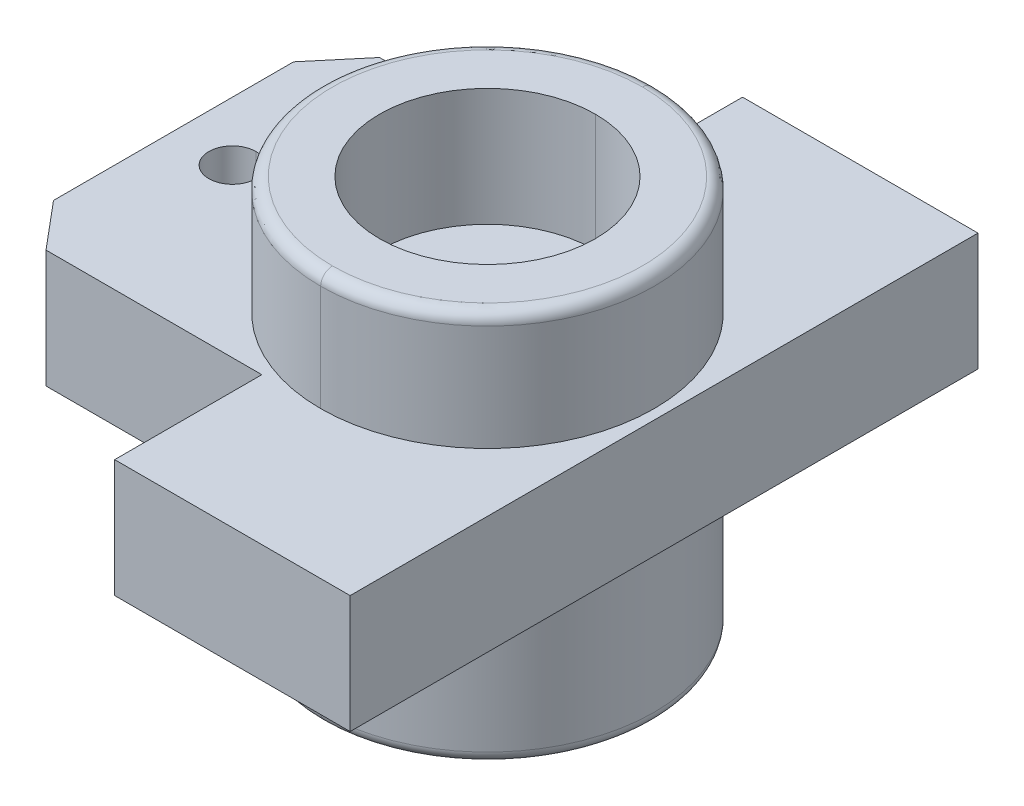
ISO-10303-21;
HEADER;
FILE_DESCRIPTION(('STEP AP214'),'2;1');
FILE_NAME('part.step','',(''),(''),'','','');
FILE_SCHEMA(('AUTOMOTIVE_DESIGN { 1 0 10303 214 1 1 1 1 }'));
ENDSEC;
DATA;
#1=APPLICATION_CONTEXT('core data for automotive mechanical design processes');
#2=APPLICATION_PROTOCOL_DEFINITION('international standard','automotive_design',2000,#1);
#3=PRODUCT_CONTEXT('',#1,'mechanical');
#4=PRODUCT('Part','Part','',(#3));
#5=PRODUCT_RELATED_PRODUCT_CATEGORY('part','',(#4));
#6=PRODUCT_DEFINITION_FORMATION('','',#4);
#7=PRODUCT_DEFINITION_CONTEXT('part definition',#1,'design');
#8=PRODUCT_DEFINITION('design','',#6,#7);
#9=PRODUCT_DEFINITION_SHAPE('','',#8);
#10=(LENGTH_UNIT() NAMED_UNIT(*) SI_UNIT(.MILLI.,.METRE.));
#11=(NAMED_UNIT(*) PLANE_ANGLE_UNIT() SI_UNIT($,.RADIAN.));
#12=(NAMED_UNIT(*) SI_UNIT($,.STERADIAN.) SOLID_ANGLE_UNIT());
#13=UNCERTAINTY_MEASURE_WITH_UNIT(LENGTH_MEASURE(1.E-05),#10,'distance_accuracy_value','');
#14=(GEOMETRIC_REPRESENTATION_CONTEXT(3) GLOBAL_UNCERTAINTY_ASSIGNED_CONTEXT((#13)) GLOBAL_UNIT_ASSIGNED_CONTEXT((#10,
#11,#12)) REPRESENTATION_CONTEXT('',''));
#15=CARTESIAN_POINT('',(0.,0.,0.));
#16=DIRECTION('',(0.,0.,1.));
#17=DIRECTION('',(1.,0.,0.));
#18=AXIS2_PLACEMENT_3D('',#15,#16,#17);
#19=CARTESIAN_POINT('',(-8.,-1.5,3.05824640740579));
#20=DIRECTION('',(-0.766044443118978,0.,0.64278760968654));
#21=DIRECTION('',(0.,1.,0.));
#22=AXIS2_PLACEMENT_3D('',#19,#20,#21);
#23=PLANE('',#22);
#24=DIRECTION('',(-0.64278760968654,0.,-0.766044443118978));
#25=VECTOR('',#24,1.);
#26=CARTESIAN_POINT('',(-6.20048509698519,-1.5,5.20282475800051));
#27=LINE('',#26,#25);
#28=CARTESIAN_POINT('',(-7.,-1.5,4.25));
#29=VERTEX_POINT('',#28);
#30=CARTESIAN_POINT('',(-8.,-1.5,3.05824640740579));
#31=VERTEX_POINT('',#30);
#32=EDGE_CURVE('E369',#29,#31,#27,.T.);
#33=ORIENTED_EDGE('',*,*,#32,.F.);
#34=DIRECTION('',(0.,-1.,0.));
#35=VECTOR('',#34,1.);
#36=CARTESIAN_POINT('',(-7.,-1.5,4.25));
#37=LINE('',#36,#35);
#38=CARTESIAN_POINT('',(-7.,1.5,4.25));
#39=VERTEX_POINT('',#38);
#40=EDGE_CURVE('E418',#39,#29,#37,.T.);
#41=ORIENTED_EDGE('',*,*,#40,.F.);
#42=DIRECTION('',(0.64278760968654,0.,0.766044443118978));
#43=VECTOR('',#42,1.);
#44=CARTESIAN_POINT('',(-8.,1.5,3.05824640740579));
#45=LINE('',#44,#43);
#46=CARTESIAN_POINT('',(-8.,1.5,3.05824640740579));
#47=VERTEX_POINT('',#46);
#48=EDGE_CURVE('E11',#47,#39,#45,.T.);
#49=ORIENTED_EDGE('',*,*,#48,.F.);
#50=DIRECTION('',(0.,1.,0.));
#51=VECTOR('',#50,1.);
#52=CARTESIAN_POINT('',(-8.,1.5,3.05824640740579));
#53=LINE('',#52,#51);
#54=EDGE_CURVE('E21',#31,#47,#53,.T.);
#55=ORIENTED_EDGE('',*,*,#54,.F.);
#56=EDGE_LOOP('',(#33,#41,#49,#55));
#57=FACE_BOUND('',#56,.T.);
#58=ADVANCED_FACE('F17',(#57),#23,.T.);
#59=CARTESIAN_POINT('',(-7.,-1.5,-4.25));
#60=DIRECTION('',(0.766044443118978,0.,0.64278760968654));
#61=DIRECTION('',(0.,-1.,0.));
#62=AXIS2_PLACEMENT_3D('',#59,#60,#61);
#63=PLANE('',#62);
#64=DIRECTION('',(0.64278760968654,0.,-0.766044443118978));
#65=VECTOR('',#64,1.);
#66=CARTESIAN_POINT('',(-6.20048509698519,-1.5,-5.2028247580005));
#67=LINE('',#66,#65);
#68=CARTESIAN_POINT('',(-8.,-1.5,-3.05824640740579));
#69=VERTEX_POINT('',#68);
#70=CARTESIAN_POINT('',(-7.,-1.5,-4.25));
#71=VERTEX_POINT('',#70);
#72=EDGE_CURVE('E361',#69,#71,#67,.T.);
#73=ORIENTED_EDGE('',*,*,#72,.F.);
#74=DIRECTION('',(0.,-1.,0.));
#75=VECTOR('',#74,1.);
#76=CARTESIAN_POINT('',(-8.,-1.5,-3.05824640740579));
#77=LINE('',#76,#75);
#78=CARTESIAN_POINT('',(-8.,1.5,-3.05824640740579));
#79=VERTEX_POINT('',#78);
#80=EDGE_CURVE('E465',#79,#69,#77,.T.);
#81=ORIENTED_EDGE('',*,*,#80,.F.);
#82=DIRECTION('',(-0.64278760968654,0.,0.766044443118978));
#83=VECTOR('',#82,1.);
#84=CARTESIAN_POINT('',(-7.,1.5,-4.25));
#85=LINE('',#84,#83);
#86=CARTESIAN_POINT('',(-7.,1.5,-4.25));
#87=VERTEX_POINT('',#86);
#88=EDGE_CURVE('E27',#87,#79,#85,.T.);
#89=ORIENTED_EDGE('',*,*,#88,.F.);
#90=DIRECTION('',(0.,1.,0.));
#91=VECTOR('',#90,1.);
#92=CARTESIAN_POINT('',(-7.,-1.5,-4.25));
#93=LINE('',#92,#91);
#94=EDGE_CURVE('E332',#71,#87,#93,.T.);
#95=ORIENTED_EDGE('',*,*,#94,.F.);
#96=EDGE_LOOP('',(#73,#81,#89,#95));
#97=FACE_BOUND('',#96,.T.);
#98=ADVANCED_FACE('F19',(#97),#63,.F.);
#99=CARTESIAN_POINT('',(0.,4.2,0.));
#100=DIRECTION('',(0.,1.,0.));
#101=DIRECTION('',(0.,0.,1.));
#102=AXIS2_PLACEMENT_3D('',#99,#100,#101);
#103=TOROIDAL_SURFACE('',#102,3.95,0.3);
#104=CARTESIAN_POINT('',(0.,4.2,-3.95));
#105=DIRECTION('',(1.,0.,0.));
#106=DIRECTION('',(0.,0.,-1.));
#107=AXIS2_PLACEMENT_3D('',#104,#105,#106);
#108=CIRCLE('',#107,0.3);
#109=CARTESIAN_POINT('',(0.,4.2,-4.25));
#110=VERTEX_POINT('',#109);
#111=CARTESIAN_POINT('',(0.,4.5,-3.95));
#112=VERTEX_POINT('',#111);
#113=EDGE_CURVE('E566',#110,#112,#108,.T.);
#114=ORIENTED_EDGE('',*,*,#113,.F.);
#115=CARTESIAN_POINT('',(0.,4.2,0.));
#116=DIRECTION('',(0.,-1.,0.));
#117=DIRECTION('',(0.,0.,1.));
#118=AXIS2_PLACEMENT_3D('',#115,#116,#117);
#119=CIRCLE('',#118,4.25);
#120=CARTESIAN_POINT('',(0.,4.2,4.25));
#121=VERTEX_POINT('',#120);
#122=EDGE_CURVE('E393',#121,#110,#119,.T.);
#123=ORIENTED_EDGE('',*,*,#122,.F.);
#124=CARTESIAN_POINT('',(0.,4.2,3.95));
#125=DIRECTION('',(-1.,0.,0.));
#126=DIRECTION('',(0.,0.,1.));
#127=AXIS2_PLACEMENT_3D('',#124,#125,#126);
#128=CIRCLE('',#127,0.3);
#129=CARTESIAN_POINT('',(0.,4.5,3.95));
#130=VERTEX_POINT('',#129);
#131=EDGE_CURVE('E518',#121,#130,#128,.T.);
#132=ORIENTED_EDGE('',*,*,#131,.T.);
#133=CARTESIAN_POINT('',(0.,4.5,0.));
#134=DIRECTION('',(0.,1.,0.));
#135=DIRECTION('',(0.,0.,1.));
#136=AXIS2_PLACEMENT_3D('',#133,#134,#135);
#137=CIRCLE('',#136,3.95);
#138=EDGE_CURVE('E387',#112,#130,#137,.T.);
#139=ORIENTED_EDGE('',*,*,#138,.F.);
#140=EDGE_LOOP('',(#114,#123,#132,#139));
#141=FACE_BOUND('',#140,.T.);
#142=ADVANCED_FACE('F589',(#141),#103,.T.);
#143=CARTESIAN_POINT('',(0.,-5.2,0.));
#144=DIRECTION('',(0.,1.,0.));
#145=DIRECTION('',(0.,0.,1.));
#146=AXIS2_PLACEMENT_3D('',#143,#144,#145);
#147=TOROIDAL_SURFACE('',#146,3.95,0.3);
#148=CARTESIAN_POINT('',(0.,-5.2,-3.95));
#149=DIRECTION('',(1.,0.,0.));
#150=DIRECTION('',(0.,0.,-1.));
#151=AXIS2_PLACEMENT_3D('',#148,#149,#150);
#152=CIRCLE('',#151,0.3);
#153=CARTESIAN_POINT('',(0.,-5.5,-3.95));
#154=VERTEX_POINT('',#153);
#155=CARTESIAN_POINT('',(0.,-5.2,-4.25));
#156=VERTEX_POINT('',#155);
#157=EDGE_CURVE('E517',#154,#156,#152,.T.);
#158=ORIENTED_EDGE('',*,*,#157,.F.);
#159=CARTESIAN_POINT('',(0.,-5.5,0.));
#160=DIRECTION('',(0.,-1.,0.));
#161=DIRECTION('',(0.,0.,1.));
#162=AXIS2_PLACEMENT_3D('',#159,#160,#161);
#163=CIRCLE('',#162,3.95);
#164=CARTESIAN_POINT('',(0.,-5.5,3.95));
#165=VERTEX_POINT('',#164);
#166=EDGE_CURVE('E408',#165,#154,#163,.T.);
#167=ORIENTED_EDGE('',*,*,#166,.F.);
#168=CARTESIAN_POINT('',(0.,-5.2,3.95));
#169=DIRECTION('',(-1.,0.,0.));
#170=DIRECTION('',(0.,0.,1.));
#171=AXIS2_PLACEMENT_3D('',#168,#169,#170);
#172=CIRCLE('',#171,0.3);
#173=CARTESIAN_POINT('',(0.,-5.2,4.25));
#174=VERTEX_POINT('',#173);
#175=EDGE_CURVE('E270',#165,#174,#172,.T.);
#176=ORIENTED_EDGE('',*,*,#175,.T.);
#177=CARTESIAN_POINT('',(0.,-5.2,0.));
#178=DIRECTION('',(0.,1.,0.));
#179=DIRECTION('',(0.,0.,1.));
#180=AXIS2_PLACEMENT_3D('',#177,#178,#179);
#181=CIRCLE('',#180,4.25);
#182=EDGE_CURVE('E404',#156,#174,#181,.T.);
#183=ORIENTED_EDGE('',*,*,#182,.F.);
#184=EDGE_LOOP('',(#158,#167,#176,#183));
#185=FACE_BOUND('',#184,.T.);
#186=ADVANCED_FACE('F593',(#185),#147,.T.);
#187=CARTESIAN_POINT('',(0.,1.5,0.));
#188=DIRECTION('',(0.,-1.,0.));
#189=DIRECTION('',(0.,0.,-1.));
#190=AXIS2_PLACEMENT_3D('',#187,#188,#189);
#191=PLANE('',#190);
#192=CARTESIAN_POINT('',(-6.5,1.5,0.));
#193=DIRECTION('',(0.,1.,0.));
#194=DIRECTION('',(0.,0.,1.));
#195=AXIS2_PLACEMENT_3D('',#192,#193,#194);
#196=CIRCLE('',#195,0.6);
#197=CARTESIAN_POINT('',(-6.5,1.5,0.6));
#198=VERTEX_POINT('',#197);
#199=CARTESIAN_POINT('',(-6.5,1.5,-0.6));
#200=VERTEX_POINT('',#199);
#201=EDGE_CURVE('E235',#198,#200,#196,.T.);
#202=ORIENTED_EDGE('',*,*,#201,.F.);
#203=CARTESIAN_POINT('',(-6.5,1.5,0.));
#204=DIRECTION('',(0.,1.,0.));
#205=DIRECTION('',(0.,0.,1.));
#206=AXIS2_PLACEMENT_3D('',#203,#204,#205);
#207=CIRCLE('',#206,0.6);
#208=EDGE_CURVE('E240',#200,#198,#207,.T.);
#209=ORIENTED_EDGE('',*,*,#208,.F.);
#210=EDGE_LOOP('',(#202,#209));
#211=FACE_BOUND('',#210,.T.);
#212=CARTESIAN_POINT('',(0.,1.5,0.));
#213=DIRECTION('',(0.,-1.,0.));
#214=DIRECTION('',(0.,0.,-1.));
#215=AXIS2_PLACEMENT_3D('',#212,#213,#214);
#216=CIRCLE('',#215,4.25);
#217=CARTESIAN_POINT('',(0.,1.5,4.25));
#218=VERTEX_POINT('',#217);
#219=CARTESIAN_POINT('',(0.,1.5,-4.25));
#220=VERTEX_POINT('',#219);
#221=EDGE_CURVE('E390',#218,#220,#216,.T.);
#222=ORIENTED_EDGE('',*,*,#221,.T.);
#223=CARTESIAN_POINT('',(0.,1.5,0.));
#224=DIRECTION('',(0.,-1.,0.));
#225=DIRECTION('',(0.,0.,-1.));
#226=AXIS2_PLACEMENT_3D('',#223,#224,#225);
#227=CIRCLE('',#226,4.25);
#228=EDGE_CURVE('E292',#220,#218,#227,.T.);
#229=ORIENTED_EDGE('',*,*,#228,.T.);
#230=EDGE_LOOP('',(#222,#229));
#231=FACE_BOUND('',#230,.T.);
#232=DIRECTION('',(1.,0.,0.));
#233=VECTOR('',#232,1.);
#234=CARTESIAN_POINT('',(-8.,1.5,-4.25));
#235=LINE('',#234,#233);
#236=CARTESIAN_POINT('',(-1.5,1.5,-4.25));
#237=VERTEX_POINT('',#236);
#238=EDGE_CURVE('E380',#87,#237,#235,.T.);
#239=ORIENTED_EDGE('',*,*,#238,.F.);
#240=ORIENTED_EDGE('',*,*,#88,.T.);
#241=DIRECTION('',(0.,0.,-1.));
#242=VECTOR('',#241,1.);
#243=CARTESIAN_POINT('',(-8.,1.5,4.25));
#244=LINE('',#243,#242);
#245=EDGE_CURVE('E373',#47,#79,#244,.T.);
#246=ORIENTED_EDGE('',*,*,#245,.F.);
#247=ORIENTED_EDGE('',*,*,#48,.T.);
#248=DIRECTION('',(1.,0.,0.));
#249=VECTOR('',#248,1.);
#250=CARTESIAN_POINT('',(-8.,1.5,4.25));
#251=LINE('',#250,#249);
#252=CARTESIAN_POINT('',(-1.5,1.5,4.25));
#253=VERTEX_POINT('',#252);
#254=EDGE_CURVE('E415',#39,#253,#251,.T.);
#255=ORIENTED_EDGE('',*,*,#254,.T.);
#256=DIRECTION('',(0.,0.,-1.));
#257=VECTOR('',#256,1.);
#258=CARTESIAN_POINT('',(-1.5,1.5,8.));
#259=LINE('',#258,#257);
#260=CARTESIAN_POINT('',(-1.5,1.5,8.));
#261=VERTEX_POINT('',#260);
#262=EDGE_CURVE('E305',#261,#253,#259,.T.);
#263=ORIENTED_EDGE('',*,*,#262,.F.);
#264=DIRECTION('',(-1.,0.,0.));
#265=VECTOR('',#264,1.);
#266=CARTESIAN_POINT('',(4.5,1.5,8.));
#267=LINE('',#266,#265);
#268=CARTESIAN_POINT('',(4.5,1.5,8.));
#269=VERTEX_POINT('',#268);
#270=EDGE_CURVE('E397',#269,#261,#267,.T.);
#271=ORIENTED_EDGE('',*,*,#270,.F.);
#272=DIRECTION('',(0.,0.,1.));
#273=VECTOR('',#272,1.);
#274=CARTESIAN_POINT('',(4.5,1.5,-8.));
#275=LINE('',#274,#273);
#276=CARTESIAN_POINT('',(4.5,1.5,-8.));
#277=VERTEX_POINT('',#276);
#278=EDGE_CURVE('E328',#277,#269,#275,.T.);
#279=ORIENTED_EDGE('',*,*,#278,.F.);
#280=DIRECTION('',(1.,0.,0.));
#281=VECTOR('',#280,1.);
#282=CARTESIAN_POINT('',(-1.5,1.5,-8.));
#283=LINE('',#282,#281);
#284=CARTESIAN_POINT('',(-1.5,1.5,-8.));
#285=VERTEX_POINT('',#284);
#286=EDGE_CURVE('E431',#285,#277,#283,.T.);
#287=ORIENTED_EDGE('',*,*,#286,.F.);
#288=DIRECTION('',(0.,0.,1.));
#289=VECTOR('',#288,1.);
#290=CARTESIAN_POINT('',(-1.5,1.5,-8.));
#291=LINE('',#290,#289);
#292=EDGE_CURVE('E424',#285,#237,#291,.T.);
#293=ORIENTED_EDGE('',*,*,#292,.T.);
#294=EDGE_LOOP('',(#239,#240,#246,#247,#255,#263,#271,#279,#287,#293));
#295=FACE_BOUND('',#294,.T.);
#296=ADVANCED_FACE('F237',(#211,#231,#295),#191,.F.);
#297=CARTESIAN_POINT('',(-8.,-1.5,4.25));
#298=DIRECTION('',(1.,0.,0.));
#299=DIRECTION('',(0.,1.,0.));
#300=AXIS2_PLACEMENT_3D('',#297,#298,#299);
#301=PLANE('',#300);
#302=ORIENTED_EDGE('',*,*,#245,.T.);
#303=ORIENTED_EDGE('',*,*,#80,.T.);
#304=DIRECTION('',(0.,0.,-1.));
#305=VECTOR('',#304,1.);
#306=CARTESIAN_POINT('',(-8.,-1.5,4.25));
#307=LINE('',#306,#305);
#308=EDGE_CURVE('E357',#31,#69,#307,.T.);
#309=ORIENTED_EDGE('',*,*,#308,.F.);
#310=ORIENTED_EDGE('',*,*,#54,.T.);
#311=EDGE_LOOP('',(#302,#303,#309,#310));
#312=FACE_BOUND('',#311,.T.);
#313=ADVANCED_FACE('F476',(#312),#301,.F.);
#314=CARTESIAN_POINT('',(0.,-1.5,0.));
#315=DIRECTION('',(0.,-1.,0.));
#316=DIRECTION('',(0.,0.,-1.));
#317=AXIS2_PLACEMENT_3D('',#314,#315,#316);
#318=PLANE('',#317);
#319=CARTESIAN_POINT('',(-6.5,-1.5,0.));
#320=DIRECTION('',(0.,1.,0.));
#321=DIRECTION('',(0.,0.,1.));
#322=AXIS2_PLACEMENT_3D('',#319,#320,#321);
#323=CIRCLE('',#322,0.6);
#324=CARTESIAN_POINT('',(-6.5,-1.5,0.6));
#325=VERTEX_POINT('',#324);
#326=CARTESIAN_POINT('',(-6.5,-1.5,-0.6));
#327=VERTEX_POINT('',#326);
#328=EDGE_CURVE('E246',#325,#327,#323,.T.);
#329=ORIENTED_EDGE('',*,*,#328,.T.);
#330=CARTESIAN_POINT('',(-6.5,-1.5,0.));
#331=DIRECTION('',(0.,1.,0.));
#332=DIRECTION('',(0.,0.,1.));
#333=AXIS2_PLACEMENT_3D('',#330,#331,#332);
#334=CIRCLE('',#333,0.6);
#335=EDGE_CURVE('E266',#327,#325,#334,.T.);
#336=ORIENTED_EDGE('',*,*,#335,.T.);
#337=EDGE_LOOP('',(#329,#336));
#338=FACE_BOUND('',#337,.T.);
#339=CARTESIAN_POINT('',(0.,-1.5,0.));
#340=DIRECTION('',(0.,-1.,0.));
#341=DIRECTION('',(0.,0.,-1.));
#342=AXIS2_PLACEMENT_3D('',#339,#340,#341);
#343=CIRCLE('',#342,4.25);
#344=CARTESIAN_POINT('',(0.,-1.5,4.25));
#345=VERTEX_POINT('',#344);
#346=CARTESIAN_POINT('',(0.,-1.5,-4.25));
#347=VERTEX_POINT('',#346);
#348=EDGE_CURVE('E405',#345,#347,#343,.T.);
#349=ORIENTED_EDGE('',*,*,#348,.F.);
#350=CARTESIAN_POINT('',(0.,-1.5,0.));
#351=DIRECTION('',(0.,-1.,0.));
#352=DIRECTION('',(0.,0.,-1.));
#353=AXIS2_PLACEMENT_3D('',#350,#351,#352);
#354=CIRCLE('',#353,4.25);
#355=EDGE_CURVE('E276',#347,#345,#354,.T.);
#356=ORIENTED_EDGE('',*,*,#355,.F.);
#357=EDGE_LOOP('',(#349,#356));
#358=FACE_BOUND('',#357,.T.);
#359=ORIENTED_EDGE('',*,*,#308,.T.);
#360=ORIENTED_EDGE('',*,*,#72,.T.);
#361=DIRECTION('',(1.,0.,0.));
#362=VECTOR('',#361,1.);
#363=CARTESIAN_POINT('',(-8.,-1.5,-4.25));
#364=LINE('',#363,#362);
#365=CARTESIAN_POINT('',(-1.5,-1.5,-4.25));
#366=VERTEX_POINT('',#365);
#367=EDGE_CURVE('E245',#71,#366,#364,.T.);
#368=ORIENTED_EDGE('',*,*,#367,.T.);
#369=DIRECTION('',(0.,0.,1.));
#370=VECTOR('',#369,1.);
#371=CARTESIAN_POINT('',(-1.5,-1.5,-8.));
#372=LINE('',#371,#370);
#373=CARTESIAN_POINT('',(-1.5,-1.5,-8.));
#374=VERTEX_POINT('',#373);
#375=EDGE_CURVE('E428',#374,#366,#372,.T.);
#376=ORIENTED_EDGE('',*,*,#375,.F.);
#377=DIRECTION('',(1.,0.,0.));
#378=VECTOR('',#377,1.);
#379=CARTESIAN_POINT('',(-1.5,-1.5,-8.));
#380=LINE('',#379,#378);
#381=CARTESIAN_POINT('',(4.5,-1.5,-8.));
#382=VERTEX_POINT('',#381);
#383=EDGE_CURVE('E442',#374,#382,#380,.T.);
#384=ORIENTED_EDGE('',*,*,#383,.T.);
#385=DIRECTION('',(0.,0.,1.));
#386=VECTOR('',#385,1.);
#387=CARTESIAN_POINT('',(4.5,-1.5,-8.));
#388=LINE('',#387,#386);
#389=CARTESIAN_POINT('',(4.5,-1.5,8.));
#390=VERTEX_POINT('',#389);
#391=EDGE_CURVE('E327',#382,#390,#388,.T.);
#392=ORIENTED_EDGE('',*,*,#391,.T.);
#393=DIRECTION('',(-1.,0.,0.));
#394=VECTOR('',#393,1.);
#395=CARTESIAN_POINT('',(4.5,-1.5,8.));
#396=LINE('',#395,#394);
#397=CARTESIAN_POINT('',(-1.5,-1.5,8.));
#398=VERTEX_POINT('',#397);
#399=EDGE_CURVE('E310',#390,#398,#396,.T.);
#400=ORIENTED_EDGE('',*,*,#399,.T.);
#401=DIRECTION('',(0.,0.,-1.));
#402=VECTOR('',#401,1.);
#403=CARTESIAN_POINT('',(-1.5,-1.5,8.));
#404=LINE('',#403,#402);
#405=CARTESIAN_POINT('',(-1.5,-1.5,4.25));
#406=VERTEX_POINT('',#405);
#407=EDGE_CURVE('E318',#398,#406,#404,.T.);
#408=ORIENTED_EDGE('',*,*,#407,.T.);
#409=DIRECTION('',(1.,0.,0.));
#410=VECTOR('',#409,1.);
#411=CARTESIAN_POINT('',(-8.,-1.5,4.25));
#412=LINE('',#411,#410);
#413=EDGE_CURVE('E362',#29,#406,#412,.T.);
#414=ORIENTED_EDGE('',*,*,#413,.F.);
#415=ORIENTED_EDGE('',*,*,#32,.T.);
#416=EDGE_LOOP('',(#359,#360,#368,#376,#384,#392,#400,#408,#414,#415));
#417=FACE_BOUND('',#416,.T.);
#418=ADVANCED_FACE('F547',(#338,#358,#417),#318,.T.);
#419=CARTESIAN_POINT('',(-8.,-1.5,4.25));
#420=DIRECTION('',(0.,0.,1.));
#421=DIRECTION('',(1.,0.,0.));
#422=AXIS2_PLACEMENT_3D('',#419,#420,#421);
#423=PLANE('',#422);
#424=ORIENTED_EDGE('',*,*,#254,.F.);
#425=ORIENTED_EDGE('',*,*,#40,.T.);
#426=ORIENTED_EDGE('',*,*,#413,.T.);
#427=DIRECTION('',(0.,1.,0.));
#428=VECTOR('',#427,1.);
#429=CARTESIAN_POINT('',(-1.5,-1.5,4.25));
#430=LINE('',#429,#428);
#431=EDGE_CURVE('E309',#406,#253,#430,.T.);
#432=ORIENTED_EDGE('',*,*,#431,.T.);
#433=EDGE_LOOP('',(#424,#425,#426,#432));
#434=FACE_BOUND('',#433,.T.);
#435=ADVANCED_FACE('F480',(#434),#423,.T.);
#436=CARTESIAN_POINT('',(-1.5,-1.5,8.));
#437=DIRECTION('',(1.,0.,0.));
#438=DIRECTION('',(0.,0.,1.));
#439=AXIS2_PLACEMENT_3D('',#436,#437,#438);
#440=PLANE('',#439);
#441=DIRECTION('',(0.,1.,0.));
#442=VECTOR('',#441,1.);
#443=CARTESIAN_POINT('',(-1.5,-1.5,8.));
#444=LINE('',#443,#442);
#445=EDGE_CURVE('E401',#398,#261,#444,.T.);
#446=ORIENTED_EDGE('',*,*,#445,.T.);
#447=ORIENTED_EDGE('',*,*,#262,.T.);
#448=ORIENTED_EDGE('',*,*,#431,.F.);
#449=ORIENTED_EDGE('',*,*,#407,.F.);
#450=EDGE_LOOP('',(#446,#447,#448,#449));
#451=FACE_BOUND('',#450,.T.);
#452=ADVANCED_FACE('F483',(#451),#440,.F.);
#453=CARTESIAN_POINT('',(4.5,-1.5,8.));
#454=DIRECTION('',(0.,0.,-1.));
#455=DIRECTION('',(0.,-1.,0.));
#456=AXIS2_PLACEMENT_3D('',#453,#454,#455);
#457=PLANE('',#456);
#458=DIRECTION('',(0.,1.,0.));
#459=VECTOR('',#458,1.);
#460=CARTESIAN_POINT('',(4.5,-1.5,8.));
#461=LINE('',#460,#459);
#462=EDGE_CURVE('E323',#390,#269,#461,.T.);
#463=ORIENTED_EDGE('',*,*,#462,.T.);
#464=ORIENTED_EDGE('',*,*,#270,.T.);
#465=ORIENTED_EDGE('',*,*,#445,.F.);
#466=ORIENTED_EDGE('',*,*,#399,.F.);
#467=EDGE_LOOP('',(#463,#464,#465,#466));
#468=FACE_BOUND('',#467,.T.);
#469=ADVANCED_FACE('F487',(#468),#457,.F.);
#470=CARTESIAN_POINT('',(4.5,-1.5,-8.));
#471=DIRECTION('',(-1.,0.,0.));
#472=DIRECTION('',(0.,0.,1.));
#473=AXIS2_PLACEMENT_3D('',#470,#471,#472);
#474=PLANE('',#473);
#475=DIRECTION('',(0.,1.,0.));
#476=VECTOR('',#475,1.);
#477=CARTESIAN_POINT('',(4.5,-1.5,-8.));
#478=LINE('',#477,#476);
#479=EDGE_CURVE('E438',#382,#277,#478,.T.);
#480=ORIENTED_EDGE('',*,*,#479,.T.);
#481=ORIENTED_EDGE('',*,*,#278,.T.);
#482=ORIENTED_EDGE('',*,*,#462,.F.);
#483=ORIENTED_EDGE('',*,*,#391,.F.);
#484=EDGE_LOOP('',(#480,#481,#482,#483));
#485=FACE_BOUND('',#484,.T.);
#486=ADVANCED_FACE('F490',(#485),#474,.F.);
#487=CARTESIAN_POINT('',(-1.5,-1.5,-8.));
#488=DIRECTION('',(0.,0.,1.));
#489=DIRECTION('',(1.,0.,0.));
#490=AXIS2_PLACEMENT_3D('',#487,#488,#489);
#491=PLANE('',#490);
#492=DIRECTION('',(0.,1.,0.));
#493=VECTOR('',#492,1.);
#494=CARTESIAN_POINT('',(-1.5,-1.5,-8.));
#495=LINE('',#494,#493);
#496=EDGE_CURVE('E427',#374,#285,#495,.T.);
#497=ORIENTED_EDGE('',*,*,#496,.T.);
#498=ORIENTED_EDGE('',*,*,#286,.T.);
#499=ORIENTED_EDGE('',*,*,#479,.F.);
#500=ORIENTED_EDGE('',*,*,#383,.F.);
#501=EDGE_LOOP('',(#497,#498,#499,#500));
#502=FACE_BOUND('',#501,.T.);
#503=ADVANCED_FACE('F493',(#502),#491,.F.);
#504=CARTESIAN_POINT('',(-1.5,-1.5,-8.));
#505=DIRECTION('',(-1.,0.,0.));
#506=DIRECTION('',(0.,1.,0.));
#507=AXIS2_PLACEMENT_3D('',#504,#505,#506);
#508=PLANE('',#507);
#509=DIRECTION('',(0.,1.,0.));
#510=VECTOR('',#509,1.);
#511=CARTESIAN_POINT('',(-1.5,-1.5,-4.25));
#512=LINE('',#511,#510);
#513=EDGE_CURVE('E384',#366,#237,#512,.T.);
#514=ORIENTED_EDGE('',*,*,#513,.T.);
#515=ORIENTED_EDGE('',*,*,#292,.F.);
#516=ORIENTED_EDGE('',*,*,#496,.F.);
#517=ORIENTED_EDGE('',*,*,#375,.T.);
#518=EDGE_LOOP('',(#514,#515,#516,#517));
#519=FACE_BOUND('',#518,.T.);
#520=ADVANCED_FACE('F499',(#519),#508,.T.);
#521=CARTESIAN_POINT('',(-8.,-1.5,-4.25));
#522=DIRECTION('',(0.,0.,1.));
#523=DIRECTION('',(1.,0.,0.));
#524=AXIS2_PLACEMENT_3D('',#521,#522,#523);
#525=PLANE('',#524);
#526=ORIENTED_EDGE('',*,*,#367,.F.);
#527=ORIENTED_EDGE('',*,*,#94,.T.);
#528=ORIENTED_EDGE('',*,*,#238,.T.);
#529=ORIENTED_EDGE('',*,*,#513,.F.);
#530=EDGE_LOOP('',(#526,#527,#528,#529));
#531=FACE_BOUND('',#530,.T.);
#532=ADVANCED_FACE('F503',(#531),#525,.F.);
#533=CARTESIAN_POINT('',(-6.5,-1.5,0.));
#534=DIRECTION('',(0.,1.,0.));
#535=DIRECTION('',(0.,0.,1.));
#536=AXIS2_PLACEMENT_3D('',#533,#534,#535);
#537=CYLINDRICAL_SURFACE('',#536,0.6);
#538=DIRECTION('',(0.,1.,0.));
#539=VECTOR('',#538,1.);
#540=CARTESIAN_POINT('',(-6.5,-1.5,-0.6));
#541=LINE('',#540,#539);
#542=EDGE_CURVE('E258',#327,#200,#541,.T.);
#543=ORIENTED_EDGE('',*,*,#542,.F.);
#544=ORIENTED_EDGE('',*,*,#328,.F.);
#545=DIRECTION('',(0.,1.,0.));
#546=VECTOR('',#545,1.);
#547=CARTESIAN_POINT('',(-6.5,-1.5,0.6));
#548=LINE('',#547,#546);
#549=EDGE_CURVE('E249',#325,#198,#548,.T.);
#550=ORIENTED_EDGE('',*,*,#549,.T.);
#551=ORIENTED_EDGE('',*,*,#201,.T.);
#552=EDGE_LOOP('',(#543,#544,#550,#551));
#553=FACE_BOUND('',#552,.T.);
#554=ADVANCED_FACE('F250',(#553),#537,.F.);
#555=CARTESIAN_POINT('',(0.,-5.5,0.));
#556=DIRECTION('',(0.,1.,0.));
#557=DIRECTION('',(1.,0.,0.));
#558=AXIS2_PLACEMENT_3D('',#555,#556,#557);
#559=PLANE('',#558);
#560=CARTESIAN_POINT('',(0.,-5.5,0.));
#561=DIRECTION('',(0.,1.,0.));
#562=DIRECTION('',(0.,0.,1.));
#563=AXIS2_PLACEMENT_3D('',#560,#561,#562);
#564=CIRCLE('',#563,2.75);
#565=CARTESIAN_POINT('',(0.,-5.5,2.75));
#566=VERTEX_POINT('',#565);
#567=CARTESIAN_POINT('',(0.,-5.5,-2.75));
#568=VERTEX_POINT('',#567);
#569=EDGE_CURVE('E396',#566,#568,#564,.T.);
#570=ORIENTED_EDGE('',*,*,#569,.T.);
#571=CARTESIAN_POINT('',(0.,-5.5,0.));
#572=DIRECTION('',(0.,1.,0.));
#573=DIRECTION('',(0.,0.,1.));
#574=AXIS2_PLACEMENT_3D('',#571,#572,#573);
#575=CIRCLE('',#574,2.75);
#576=EDGE_CURVE('E275',#568,#566,#575,.T.);
#577=ORIENTED_EDGE('',*,*,#576,.T.);
#578=EDGE_LOOP('',(#570,#577));
#579=FACE_BOUND('',#578,.T.);
#580=ORIENTED_EDGE('',*,*,#166,.T.);
#581=CARTESIAN_POINT('',(0.,-5.5,0.));
#582=DIRECTION('',(0.,-1.,0.));
#583=DIRECTION('',(0.,0.,1.));
#584=AXIS2_PLACEMENT_3D('',#581,#582,#583);
#585=CIRCLE('',#584,3.95);
#586=EDGE_CURVE('E515',#154,#165,#585,.T.);
#587=ORIENTED_EDGE('',*,*,#586,.T.);
#588=EDGE_LOOP('',(#580,#587));
#589=FACE_BOUND('',#588,.T.);
#590=ADVANCED_FACE('F634',(#579,#589),#559,.F.);
#591=CARTESIAN_POINT('',(0.,-5.5,0.));
#592=DIRECTION('',(0.,1.,0.));
#593=DIRECTION('',(0.,0.,1.));
#594=AXIS2_PLACEMENT_3D('',#591,#592,#593);
#595=CYLINDRICAL_SURFACE('',#594,4.25);
#596=DIRECTION('',(0.,1.,0.));
#597=VECTOR('',#596,1.);
#598=CARTESIAN_POINT('',(0.,-5.5,-4.25));
#599=LINE('',#598,#597);
#600=EDGE_CURVE('E255',#156,#347,#599,.T.);
#601=ORIENTED_EDGE('',*,*,#600,.F.);
#602=ORIENTED_EDGE('',*,*,#182,.T.);
#603=DIRECTION('',(0.,1.,0.));
#604=VECTOR('',#603,1.);
#605=CARTESIAN_POINT('',(0.,-5.5,4.25));
#606=LINE('',#605,#604);
#607=EDGE_CURVE('E272',#174,#345,#606,.T.);
#608=ORIENTED_EDGE('',*,*,#607,.T.);
#609=ORIENTED_EDGE('',*,*,#348,.T.);
#610=EDGE_LOOP('',(#601,#602,#608,#609));
#611=FACE_BOUND('',#610,.T.);
#612=ADVANCED_FACE('F637',(#611),#595,.T.);
#613=CARTESIAN_POINT('',(0.,-5.5,0.));
#614=DIRECTION('',(0.,1.,0.));
#615=DIRECTION('',(0.,0.,1.));
#616=AXIS2_PLACEMENT_3D('',#613,#614,#615);
#617=CYLINDRICAL_SURFACE('',#616,2.75);
#618=DIRECTION('',(0.,1.,0.));
#619=VECTOR('',#618,1.);
#620=CARTESIAN_POINT('',(0.,-5.5,-2.75));
#621=LINE('',#620,#619);
#622=CARTESIAN_POINT('',(0.,-1.5,-2.75));
#623=VERTEX_POINT('',#622);
#624=EDGE_CURVE('E280',#568,#623,#621,.T.);
#625=ORIENTED_EDGE('',*,*,#624,.F.);
#626=ORIENTED_EDGE('',*,*,#569,.F.);
#627=DIRECTION('',(0.,1.,0.));
#628=VECTOR('',#627,1.);
#629=CARTESIAN_POINT('',(0.,-5.5,2.75));
#630=LINE('',#629,#628);
#631=CARTESIAN_POINT('',(0.,-1.5,2.75));
#632=VERTEX_POINT('',#631);
#633=EDGE_CURVE('E288',#566,#632,#630,.T.);
#634=ORIENTED_EDGE('',*,*,#633,.T.);
#635=CARTESIAN_POINT('',(0.,-1.5,0.));
#636=DIRECTION('',(0.,-1.,0.));
#637=DIRECTION('',(0.,0.,-1.));
#638=AXIS2_PLACEMENT_3D('',#635,#636,#637);
#639=CIRCLE('',#638,2.75);
#640=EDGE_CURVE('E356',#623,#632,#639,.T.);
#641=ORIENTED_EDGE('',*,*,#640,.F.);
#642=EDGE_LOOP('',(#625,#626,#634,#641));
#643=FACE_BOUND('',#642,.T.);
#644=ADVANCED_FACE('F708',(#643),#617,.F.);
#645=CARTESIAN_POINT('',(0.,-5.5,0.));
#646=DIRECTION('',(0.,1.,0.));
#647=DIRECTION('',(0.,0.,1.));
#648=AXIS2_PLACEMENT_3D('',#645,#646,#647);
#649=CYLINDRICAL_SURFACE('',#648,4.25);
#650=DIRECTION('',(0.,1.,0.));
#651=VECTOR('',#650,1.);
#652=CARTESIAN_POINT('',(0.,-5.5,-4.25));
#653=LINE('',#652,#651);
#654=EDGE_CURVE('E298',#220,#110,#653,.T.);
#655=ORIENTED_EDGE('',*,*,#654,.F.);
#656=ORIENTED_EDGE('',*,*,#221,.F.);
#657=DIRECTION('',(0.,1.,0.));
#658=VECTOR('',#657,1.);
#659=CARTESIAN_POINT('',(0.,-5.5,4.25));
#660=LINE('',#659,#658);
#661=EDGE_CURVE('E293',#218,#121,#660,.T.);
#662=ORIENTED_EDGE('',*,*,#661,.T.);
#663=ORIENTED_EDGE('',*,*,#122,.T.);
#664=EDGE_LOOP('',(#655,#656,#662,#663));
#665=FACE_BOUND('',#664,.T.);
#666=ADVANCED_FACE('F591',(#665),#649,.T.);
#667=CARTESIAN_POINT('',(0.,4.5,0.));
#668=DIRECTION('',(0.,1.,0.));
#669=DIRECTION('',(1.,0.,0.));
#670=AXIS2_PLACEMENT_3D('',#667,#668,#669);
#671=PLANE('',#670);
#672=CARTESIAN_POINT('',(0.,4.5,0.));
#673=DIRECTION('',(0.,1.,0.));
#674=DIRECTION('',(0.,0.,1.));
#675=AXIS2_PLACEMENT_3D('',#672,#673,#674);
#676=CIRCLE('',#675,2.75);
#677=CARTESIAN_POINT('',(0.,4.5,2.75));
#678=VERTEX_POINT('',#677);
#679=CARTESIAN_POINT('',(0.,4.5,-2.75));
#680=VERTEX_POINT('',#679);
#681=EDGE_CURVE('E379',#678,#680,#676,.T.);
#682=ORIENTED_EDGE('',*,*,#681,.F.);
#683=CARTESIAN_POINT('',(0.,4.5,0.));
#684=DIRECTION('',(0.,1.,0.));
#685=DIRECTION('',(0.,0.,1.));
#686=AXIS2_PLACEMENT_3D('',#683,#684,#685);
#687=CIRCLE('',#686,2.75);
#688=EDGE_CURVE('E322',#680,#678,#687,.T.);
#689=ORIENTED_EDGE('',*,*,#688,.F.);
#690=EDGE_LOOP('',(#682,#689));
#691=FACE_BOUND('',#690,.T.);
#692=CARTESIAN_POINT('',(0.,4.5,0.));
#693=DIRECTION('',(0.,1.,0.));
#694=DIRECTION('',(0.,0.,1.));
#695=AXIS2_PLACEMENT_3D('',#692,#693,#694);
#696=CIRCLE('',#695,3.95);
#697=EDGE_CURVE('E564',#130,#112,#696,.T.);
#698=ORIENTED_EDGE('',*,*,#697,.T.);
#699=ORIENTED_EDGE('',*,*,#138,.T.);
#700=EDGE_LOOP('',(#698,#699));
#701=FACE_BOUND('',#700,.T.);
#702=ADVANCED_FACE('F624',(#691,#701),#671,.T.);
#703=CARTESIAN_POINT('',(0.,-5.5,0.));
#704=DIRECTION('',(0.,1.,0.));
#705=DIRECTION('',(0.,0.,1.));
#706=AXIS2_PLACEMENT_3D('',#703,#704,#705);
#707=CYLINDRICAL_SURFACE('',#706,2.75);
#708=DIRECTION('',(0.,1.,0.));
#709=VECTOR('',#708,1.);
#710=CARTESIAN_POINT('',(0.,-5.5,-2.75));
#711=LINE('',#710,#709);
#712=CARTESIAN_POINT('',(0.,1.5,-2.75));
#713=VERTEX_POINT('',#712);
#714=EDGE_CURVE('E314',#713,#680,#711,.T.);
#715=ORIENTED_EDGE('',*,*,#714,.F.);
#716=CARTESIAN_POINT('',(0.,1.5,0.));
#717=DIRECTION('',(0.,-1.,0.));
#718=DIRECTION('',(0.,0.,-1.));
#719=AXIS2_PLACEMENT_3D('',#716,#717,#718);
#720=CIRCLE('',#719,2.75);
#721=CARTESIAN_POINT('',(0.,1.5,2.75));
#722=VERTEX_POINT('',#721);
#723=EDGE_CURVE('E368',#713,#722,#720,.T.);
#724=ORIENTED_EDGE('',*,*,#723,.T.);
#725=DIRECTION('',(0.,1.,0.));
#726=VECTOR('',#725,1.);
#727=CARTESIAN_POINT('',(0.,-5.5,2.75));
#728=LINE('',#727,#726);
#729=EDGE_CURVE('E336',#722,#678,#728,.T.);
#730=ORIENTED_EDGE('',*,*,#729,.T.);
#731=ORIENTED_EDGE('',*,*,#681,.T.);
#732=EDGE_LOOP('',(#715,#724,#730,#731));
#733=FACE_BOUND('',#732,.T.);
#734=ADVANCED_FACE('F627',(#733),#707,.F.);
#735=CARTESIAN_POINT('',(0.,-1.5,0.));
#736=DIRECTION('',(0.,1.,0.));
#737=DIRECTION('',(0.,0.,1.));
#738=AXIS2_PLACEMENT_3D('',#735,#736,#737);
#739=CYLINDRICAL_SURFACE('',#738,1.3);
#740=DIRECTION('',(0.,1.,0.));
#741=VECTOR('',#740,1.);
#742=CARTESIAN_POINT('',(0.,-1.5,-1.3));
#743=LINE('',#742,#741);
#744=CARTESIAN_POINT('',(0.,-1.5,-1.3));
#745=VERTEX_POINT('',#744);
#746=CARTESIAN_POINT('',(0.,1.5,-1.3));
#747=VERTEX_POINT('',#746);
#748=EDGE_CURVE('E341',#745,#747,#743,.T.);
#749=ORIENTED_EDGE('',*,*,#748,.F.);
#750=CARTESIAN_POINT('',(0.,-1.5,0.));
#751=DIRECTION('',(0.,1.,0.));
#752=DIRECTION('',(0.,0.,1.));
#753=AXIS2_PLACEMENT_3D('',#750,#751,#752);
#754=CIRCLE('',#753,1.3);
#755=CARTESIAN_POINT('',(0.,-1.5,1.3));
#756=VERTEX_POINT('',#755);
#757=EDGE_CURVE('E365',#756,#745,#754,.T.);
#758=ORIENTED_EDGE('',*,*,#757,.F.);
#759=DIRECTION('',(0.,1.,0.));
#760=VECTOR('',#759,1.);
#761=CARTESIAN_POINT('',(0.,-1.5,1.3));
#762=LINE('',#761,#760);
#763=CARTESIAN_POINT('',(0.,1.5,1.3));
#764=VERTEX_POINT('',#763);
#765=EDGE_CURVE('E352',#756,#764,#762,.T.);
#766=ORIENTED_EDGE('',*,*,#765,.T.);
#767=CARTESIAN_POINT('',(0.,1.5,0.));
#768=DIRECTION('',(0.,1.,0.));
#769=DIRECTION('',(0.,0.,1.));
#770=AXIS2_PLACEMENT_3D('',#767,#768,#769);
#771=CIRCLE('',#770,1.3);
#772=EDGE_CURVE('E376',#764,#747,#771,.T.);
#773=ORIENTED_EDGE('',*,*,#772,.T.);
#774=EDGE_LOOP('',(#749,#758,#766,#773));
#775=FACE_BOUND('',#774,.T.);
#776=ADVANCED_FACE('F622',(#775),#739,.F.);
#777=CARTESIAN_POINT('',(0.,1.5,0.));
#778=DIRECTION('',(0.,-1.,0.));
#779=DIRECTION('',(0.,0.,-1.));
#780=AXIS2_PLACEMENT_3D('',#777,#778,#779);
#781=PLANE('',#780);
#782=ORIENTED_EDGE('',*,*,#772,.F.);
#783=CARTESIAN_POINT('',(0.,1.5,0.));
#784=DIRECTION('',(0.,1.,0.));
#785=DIRECTION('',(0.,0.,1.));
#786=AXIS2_PLACEMENT_3D('',#783,#784,#785);
#787=CIRCLE('',#786,1.3);
#788=EDGE_CURVE('E348',#747,#764,#787,.T.);
#789=ORIENTED_EDGE('',*,*,#788,.F.);
#790=EDGE_LOOP('',(#782,#789));
#791=FACE_BOUND('',#790,.T.);
#792=CARTESIAN_POINT('',(0.,1.5,0.));
#793=DIRECTION('',(0.,-1.,0.));
#794=DIRECTION('',(0.,0.,-1.));
#795=AXIS2_PLACEMENT_3D('',#792,#793,#794);
#796=CIRCLE('',#795,2.75);
#797=EDGE_CURVE('E297',#722,#713,#796,.T.);
#798=ORIENTED_EDGE('',*,*,#797,.F.);
#799=ORIENTED_EDGE('',*,*,#723,.F.);
#800=EDGE_LOOP('',(#798,#799));
#801=FACE_BOUND('',#800,.T.);
#802=ADVANCED_FACE('F619',(#791,#801),#781,.F.);
#803=CARTESIAN_POINT('',(0.,-1.5,0.));
#804=DIRECTION('',(0.,-1.,0.));
#805=DIRECTION('',(0.,0.,-1.));
#806=AXIS2_PLACEMENT_3D('',#803,#804,#805);
#807=PLANE('',#806);
#808=ORIENTED_EDGE('',*,*,#757,.T.);
#809=CARTESIAN_POINT('',(0.,-1.5,0.));
#810=DIRECTION('',(0.,1.,0.));
#811=DIRECTION('',(0.,0.,1.));
#812=AXIS2_PLACEMENT_3D('',#809,#810,#811);
#813=CIRCLE('',#812,1.3);
#814=EDGE_CURVE('E337',#745,#756,#813,.T.);
#815=ORIENTED_EDGE('',*,*,#814,.T.);
#816=EDGE_LOOP('',(#808,#815));
#817=FACE_BOUND('',#816,.T.);
#818=CARTESIAN_POINT('',(0.,-1.5,0.));
#819=DIRECTION('',(0.,-1.,0.));
#820=DIRECTION('',(0.,0.,-1.));
#821=AXIS2_PLACEMENT_3D('',#818,#819,#820);
#822=CIRCLE('',#821,2.75);
#823=EDGE_CURVE('E284',#632,#623,#822,.T.);
#824=ORIENTED_EDGE('',*,*,#823,.T.);
#825=ORIENTED_EDGE('',*,*,#640,.T.);
#826=EDGE_LOOP('',(#824,#825));
#827=FACE_BOUND('',#826,.T.);
#828=ADVANCED_FACE('F617',(#817,#827),#807,.T.);
#829=CARTESIAN_POINT('',(0.,-1.5,0.));
#830=DIRECTION('',(0.,1.,0.));
#831=DIRECTION('',(0.,0.,1.));
#832=AXIS2_PLACEMENT_3D('',#829,#830,#831);
#833=CYLINDRICAL_SURFACE('',#832,1.3);
#834=ORIENTED_EDGE('',*,*,#814,.F.);
#835=ORIENTED_EDGE('',*,*,#748,.T.);
#836=ORIENTED_EDGE('',*,*,#788,.T.);
#837=ORIENTED_EDGE('',*,*,#765,.F.);
#838=EDGE_LOOP('',(#834,#835,#836,#837));
#839=FACE_BOUND('',#838,.T.);
#840=ADVANCED_FACE('F614',(#839),#833,.F.);
#841=CARTESIAN_POINT('',(0.,-5.5,0.));
#842=DIRECTION('',(0.,1.,0.));
#843=DIRECTION('',(0.,0.,1.));
#844=AXIS2_PLACEMENT_3D('',#841,#842,#843);
#845=CYLINDRICAL_SURFACE('',#844,2.75);
#846=ORIENTED_EDGE('',*,*,#797,.T.);
#847=ORIENTED_EDGE('',*,*,#714,.T.);
#848=ORIENTED_EDGE('',*,*,#688,.T.);
#849=ORIENTED_EDGE('',*,*,#729,.F.);
#850=EDGE_LOOP('',(#846,#847,#848,#849));
#851=FACE_BOUND('',#850,.T.);
#852=ADVANCED_FACE('F612',(#851),#845,.F.);
#853=CARTESIAN_POINT('',(0.,-5.5,0.));
#854=DIRECTION('',(0.,1.,0.));
#855=DIRECTION('',(0.,0.,1.));
#856=AXIS2_PLACEMENT_3D('',#853,#854,#855);
#857=CYLINDRICAL_SURFACE('',#856,4.25);
#858=ORIENTED_EDGE('',*,*,#228,.F.);
#859=ORIENTED_EDGE('',*,*,#654,.T.);
#860=CARTESIAN_POINT('',(0.,4.2,0.));
#861=DIRECTION('',(0.,-1.,0.));
#862=DIRECTION('',(0.,0.,1.));
#863=AXIS2_PLACEMENT_3D('',#860,#861,#862);
#864=CIRCLE('',#863,4.25);
#865=EDGE_CURVE('E559',#110,#121,#864,.T.);
#866=ORIENTED_EDGE('',*,*,#865,.T.);
#867=ORIENTED_EDGE('',*,*,#661,.F.);
#868=EDGE_LOOP('',(#858,#859,#866,#867));
#869=FACE_BOUND('',#868,.T.);
#870=ADVANCED_FACE('F584',(#869),#857,.T.);
#871=CARTESIAN_POINT('',(0.,-5.5,0.));
#872=DIRECTION('',(0.,1.,0.));
#873=DIRECTION('',(0.,0.,1.));
#874=AXIS2_PLACEMENT_3D('',#871,#872,#873);
#875=CYLINDRICAL_SURFACE('',#874,2.75);
#876=ORIENTED_EDGE('',*,*,#576,.F.);
#877=ORIENTED_EDGE('',*,*,#624,.T.);
#878=ORIENTED_EDGE('',*,*,#823,.F.);
#879=ORIENTED_EDGE('',*,*,#633,.F.);
#880=EDGE_LOOP('',(#876,#877,#878,#879));
#881=FACE_BOUND('',#880,.T.);
#882=ADVANCED_FACE('F774',(#881),#875,.F.);
#883=CARTESIAN_POINT('',(0.,-5.5,0.));
#884=DIRECTION('',(0.,1.,0.));
#885=DIRECTION('',(0.,0.,1.));
#886=AXIS2_PLACEMENT_3D('',#883,#884,#885);
#887=CYLINDRICAL_SURFACE('',#886,4.25);
#888=CARTESIAN_POINT('',(0.,-5.2,0.));
#889=DIRECTION('',(0.,1.,0.));
#890=DIRECTION('',(0.,0.,1.));
#891=AXIS2_PLACEMENT_3D('',#888,#889,#890);
#892=CIRCLE('',#891,4.25);
#893=EDGE_CURVE('E530',#174,#156,#892,.T.);
#894=ORIENTED_EDGE('',*,*,#893,.T.);
#895=ORIENTED_EDGE('',*,*,#600,.T.);
#896=ORIENTED_EDGE('',*,*,#355,.T.);
#897=ORIENTED_EDGE('',*,*,#607,.F.);
#898=EDGE_LOOP('',(#894,#895,#896,#897));
#899=FACE_BOUND('',#898,.T.);
#900=ADVANCED_FACE('F782',(#899),#887,.T.);
#901=CARTESIAN_POINT('',(-6.5,-1.5,0.));
#902=DIRECTION('',(0.,1.,0.));
#903=DIRECTION('',(0.,0.,1.));
#904=AXIS2_PLACEMENT_3D('',#901,#902,#903);
#905=CYLINDRICAL_SURFACE('',#904,0.6);
#906=ORIENTED_EDGE('',*,*,#335,.F.);
#907=ORIENTED_EDGE('',*,*,#542,.T.);
#908=ORIENTED_EDGE('',*,*,#208,.T.);
#909=ORIENTED_EDGE('',*,*,#549,.F.);
#910=EDGE_LOOP('',(#906,#907,#908,#909));
#911=FACE_BOUND('',#910,.T.);
#912=ADVANCED_FACE('F257',(#911),#905,.F.);
#913=CARTESIAN_POINT('',(0.,-5.2,0.));
#914=DIRECTION('',(0.,1.,0.));
#915=DIRECTION('',(0.,0.,1.));
#916=AXIS2_PLACEMENT_3D('',#913,#914,#915);
#917=TOROIDAL_SURFACE('',#916,3.95,0.3);
#918=ORIENTED_EDGE('',*,*,#586,.F.);
#919=ORIENTED_EDGE('',*,*,#157,.T.);
#920=ORIENTED_EDGE('',*,*,#893,.F.);
#921=ORIENTED_EDGE('',*,*,#175,.F.);
#922=EDGE_LOOP('',(#918,#919,#920,#921));
#923=FACE_BOUND('',#922,.T.);
#924=ADVANCED_FACE('F798',(#923),#917,.T.);
#925=CARTESIAN_POINT('',(0.,4.2,0.));
#926=DIRECTION('',(0.,1.,0.));
#927=DIRECTION('',(0.,0.,1.));
#928=AXIS2_PLACEMENT_3D('',#925,#926,#927);
#929=TOROIDAL_SURFACE('',#928,3.95,0.3);
#930=ORIENTED_EDGE('',*,*,#865,.F.);
#931=ORIENTED_EDGE('',*,*,#113,.T.);
#932=ORIENTED_EDGE('',*,*,#697,.F.);
#933=ORIENTED_EDGE('',*,*,#131,.F.);
#934=EDGE_LOOP('',(#930,#931,#932,#933));
#935=FACE_BOUND('',#934,.T.);
#936=ADVANCED_FACE('F587',(#935),#929,.T.);
#937=CLOSED_SHELL('',(#58,#98,#142,#186,#296,#313,#418,#435,#452,#469,#486,#503,#520,#532,#554,
#590,#612,#644,#666,#702,#734,#776,#802,#828,#840,#852,#870,#882,#900,#912,#924,#936));
#938=MANIFOLD_SOLID_BREP('B1',#937);
#939=ADVANCED_BREP_SHAPE_REPRESENTATION('',(#18,#938),#14);
#940=SHAPE_DEFINITION_REPRESENTATION(#9,#939);
ENDSEC;
END-ISO-10303-21;
